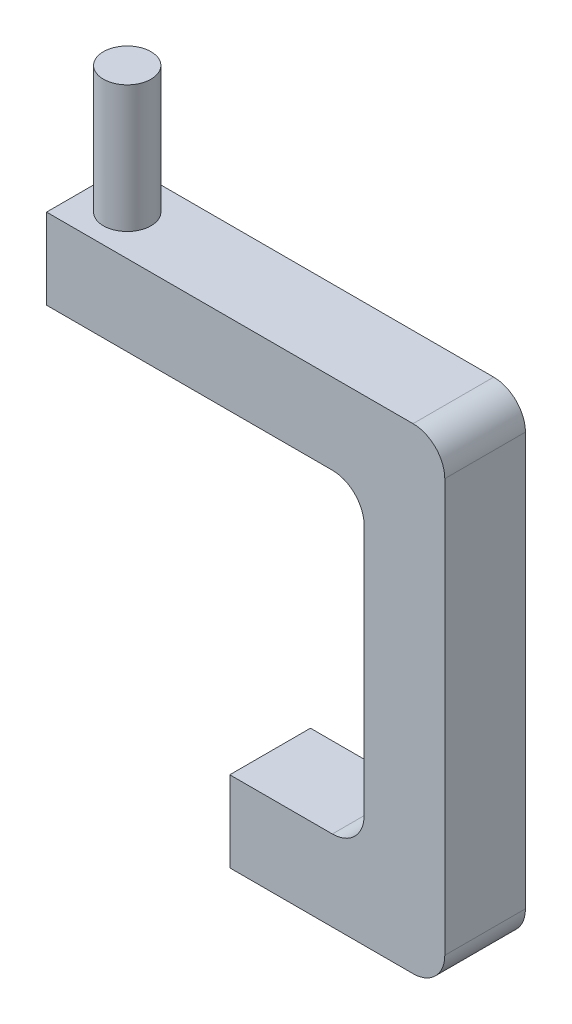
ISO-10303-21;
HEADER;
FILE_DESCRIPTION(('STEP AP214'),'2;1');
FILE_NAME('part.step','',(''),(''),'','','');
FILE_SCHEMA(('AUTOMOTIVE_DESIGN { 1 0 10303 214 1 1 1 1 }'));
ENDSEC;
DATA;
#1=APPLICATION_CONTEXT('core data for automotive mechanical design processes');
#2=APPLICATION_PROTOCOL_DEFINITION('international standard','automotive_design',2000,#1);
#3=PRODUCT_CONTEXT('',#1,'mechanical');
#4=PRODUCT('Part','Part','',(#3));
#5=PRODUCT_RELATED_PRODUCT_CATEGORY('part','',(#4));
#6=PRODUCT_DEFINITION_FORMATION('','',#4);
#7=PRODUCT_DEFINITION_CONTEXT('part definition',#1,'design');
#8=PRODUCT_DEFINITION('design','',#6,#7);
#9=PRODUCT_DEFINITION_SHAPE('','',#8);
#10=(LENGTH_UNIT() NAMED_UNIT(*) SI_UNIT(.MILLI.,.METRE.));
#11=(NAMED_UNIT(*) PLANE_ANGLE_UNIT() SI_UNIT($,.RADIAN.));
#12=(NAMED_UNIT(*) SI_UNIT($,.STERADIAN.) SOLID_ANGLE_UNIT());
#13=UNCERTAINTY_MEASURE_WITH_UNIT(LENGTH_MEASURE(1.E-05),#10,'distance_accuracy_value','');
#14=(GEOMETRIC_REPRESENTATION_CONTEXT(3) GLOBAL_UNCERTAINTY_ASSIGNED_CONTEXT((#13)) GLOBAL_UNIT_ASSIGNED_CONTEXT((#10,
#11,#12)) REPRESENTATION_CONTEXT('',''));
#15=CARTESIAN_POINT('',(0.,0.,0.));
#16=DIRECTION('',(0.,0.,1.));
#17=DIRECTION('',(1.,0.,0.));
#18=AXIS2_PLACEMENT_3D('',#15,#16,#17);
#19=CARTESIAN_POINT('',(0.,75.,25.4));
#20=DIRECTION('',(0.,-1.,0.));
#21=DIRECTION('',(1.,0.,0.));
#22=AXIS2_PLACEMENT_3D('',#19,#20,#21);
#23=PLANE('',#22);
#24=CARTESIAN_POINT('',(-100.,75.,12.7));
#25=DIRECTION('',(0.,-1.,0.));
#26=DIRECTION('',(1.,0.,0.));
#27=AXIS2_PLACEMENT_3D('',#24,#25,#26);
#28=CIRCLE('',#27,7.5);
#29=CARTESIAN_POINT('',(-92.5,75.,12.7));
#30=VERTEX_POINT('',#29);
#31=EDGE_CURVE('E161',#30,#30,#28,.F.);
#32=ORIENTED_EDGE('',*,*,#31,.F.);
#33=EDGE_LOOP('',(#32));
#34=FACE_BOUND('',#33,.T.);
#35=DIRECTION('',(-1.,0.,0.));
#36=VECTOR('',#35,1.);
#37=CARTESIAN_POINT('',(0.,75.,25.4));
#38=LINE('',#37,#36);
#39=CARTESIAN_POINT('',(2.69999999999998,75.,25.4));
#40=VERTEX_POINT('',#39);
#41=CARTESIAN_POINT('',(-112.7,75.,25.4));
#42=VERTEX_POINT('',#41);
#43=EDGE_CURVE('E131',#40,#42,#38,.T.);
#44=ORIENTED_EDGE('',*,*,#43,.F.);
#45=DIRECTION('',(0.,0.,-1.));
#46=VECTOR('',#45,1.);
#47=CARTESIAN_POINT('',(2.69999999999998,75.,0.));
#48=LINE('',#47,#46);
#49=CARTESIAN_POINT('',(2.69999999999998,75.,0.));
#50=VERTEX_POINT('',#49);
#51=EDGE_CURVE('E181',#40,#50,#48,.T.);
#52=ORIENTED_EDGE('',*,*,#51,.T.);
#53=DIRECTION('',(-1.,0.,0.));
#54=VECTOR('',#53,1.);
#55=CARTESIAN_POINT('',(0.,75.,0.));
#56=LINE('',#55,#54);
#57=CARTESIAN_POINT('',(-112.7,75.,0.));
#58=VERTEX_POINT('',#57);
#59=EDGE_CURVE('E158',#50,#58,#56,.T.);
#60=ORIENTED_EDGE('',*,*,#59,.T.);
#61=DIRECTION('',(0.,0.,-1.));
#62=VECTOR('',#61,1.);
#63=CARTESIAN_POINT('',(-112.7,75.,25.4));
#64=LINE('',#63,#62);
#65=EDGE_CURVE('E151',#42,#58,#64,.T.);
#66=ORIENTED_EDGE('',*,*,#65,.F.);
#67=EDGE_LOOP('',(#44,#52,#60,#66));
#68=FACE_BOUND('',#67,.T.);
#69=ADVANCED_FACE('F41',(#34,#68),#23,.F.);
#70=CARTESIAN_POINT('',(-112.7,0.,25.4));
#71=DIRECTION('',(1.,0.,0.));
#72=DIRECTION('',(0.,1.,0.));
#73=AXIS2_PLACEMENT_3D('',#70,#71,#72);
#74=PLANE('',#73);
#75=DIRECTION('',(0.,-1.,0.));
#76=VECTOR('',#75,1.);
#77=CARTESIAN_POINT('',(-112.7,0.,0.));
#78=LINE('',#77,#76);
#79=CARTESIAN_POINT('',(-112.7,49.6,0.));
#80=VERTEX_POINT('',#79);
#81=EDGE_CURVE('E259',#58,#80,#78,.T.);
#82=ORIENTED_EDGE('',*,*,#81,.T.);
#83=DIRECTION('',(0.,0.,-1.));
#84=VECTOR('',#83,1.);
#85=CARTESIAN_POINT('',(-112.7,49.6,25.4));
#86=LINE('',#85,#84);
#87=CARTESIAN_POINT('',(-112.7,49.6,25.4));
#88=VERTEX_POINT('',#87);
#89=EDGE_CURVE('E153',#88,#80,#86,.T.);
#90=ORIENTED_EDGE('',*,*,#89,.F.);
#91=DIRECTION('',(0.,-1.,0.));
#92=VECTOR('',#91,1.);
#93=CARTESIAN_POINT('',(-112.7,0.,25.4));
#94=LINE('',#93,#92);
#95=EDGE_CURVE('E136',#42,#88,#94,.T.);
#96=ORIENTED_EDGE('',*,*,#95,.F.);
#97=ORIENTED_EDGE('',*,*,#65,.T.);
#98=EDGE_LOOP('',(#82,#90,#96,#97));
#99=FACE_BOUND('',#98,.T.);
#100=ADVANCED_FACE('F150',(#99),#74,.F.);
#101=CARTESIAN_POINT('',(0.,49.6,25.4));
#102=DIRECTION('',(0.,-1.,0.));
#103=DIRECTION('',(1.,0.,0.));
#104=AXIS2_PLACEMENT_3D('',#101,#102,#103);
#105=PLANE('',#104);
#106=DIRECTION('',(-1.,0.,0.));
#107=VECTOR('',#106,1.);
#108=CARTESIAN_POINT('',(0.,49.6,0.));
#109=LINE('',#108,#107);
#110=CARTESIAN_POINT('',(-22.7,49.6,0.));
#111=VERTEX_POINT('',#110);
#112=EDGE_CURVE('E230',#111,#80,#109,.T.);
#113=ORIENTED_EDGE('',*,*,#112,.F.);
#114=DIRECTION('',(0.,0.,-1.));
#115=VECTOR('',#114,1.);
#116=CARTESIAN_POINT('',(-22.7,49.6,25.4));
#117=LINE('',#116,#115);
#118=CARTESIAN_POINT('',(-22.7,49.6,25.4));
#119=VERTEX_POINT('',#118);
#120=EDGE_CURVE('E178',#111,#119,#117,.F.);
#121=ORIENTED_EDGE('',*,*,#120,.T.);
#122=DIRECTION('',(-1.,0.,0.));
#123=VECTOR('',#122,1.);
#124=CARTESIAN_POINT('',(0.,49.6,25.4));
#125=LINE('',#124,#123);
#126=EDGE_CURVE('E155',#119,#88,#125,.T.);
#127=ORIENTED_EDGE('',*,*,#126,.T.);
#128=ORIENTED_EDGE('',*,*,#89,.T.);
#129=EDGE_LOOP('',(#113,#121,#127,#128));
#130=FACE_BOUND('',#129,.T.);
#131=ADVANCED_FACE('F296',(#130),#105,.T.);
#132=CARTESIAN_POINT('',(-12.7,0.,25.4));
#133=DIRECTION('',(1.,0.,0.));
#134=DIRECTION('',(0.,1.,0.));
#135=AXIS2_PLACEMENT_3D('',#132,#133,#134);
#136=PLANE('',#135);
#137=DIRECTION('',(0.,-1.,0.));
#138=VECTOR('',#137,1.);
#139=CARTESIAN_POINT('',(-12.7,0.,25.4));
#140=LINE('',#139,#138);
#141=CARTESIAN_POINT('',(-12.7,39.6,25.4));
#142=VERTEX_POINT('',#141);
#143=CARTESIAN_POINT('',(-12.7,-39.6,25.4));
#144=VERTEX_POINT('',#143);
#145=EDGE_CURVE('E241',#142,#144,#140,.T.);
#146=ORIENTED_EDGE('',*,*,#145,.F.);
#147=DIRECTION('',(0.,0.,-1.));
#148=VECTOR('',#147,1.);
#149=CARTESIAN_POINT('',(-12.7,39.6,25.4));
#150=LINE('',#149,#148);
#151=CARTESIAN_POINT('',(-12.7,39.6,0.));
#152=VERTEX_POINT('',#151);
#153=EDGE_CURVE('E174',#142,#152,#150,.T.);
#154=ORIENTED_EDGE('',*,*,#153,.T.);
#155=DIRECTION('',(0.,-1.,0.));
#156=VECTOR('',#155,1.);
#157=CARTESIAN_POINT('',(-12.7,0.,0.));
#158=LINE('',#157,#156);
#159=CARTESIAN_POINT('',(-12.7,-39.6,0.));
#160=VERTEX_POINT('',#159);
#161=EDGE_CURVE('E219',#152,#160,#158,.T.);
#162=ORIENTED_EDGE('',*,*,#161,.T.);
#163=DIRECTION('',(0.,0.,-1.));
#164=VECTOR('',#163,1.);
#165=CARTESIAN_POINT('',(-12.7,-39.6,25.4));
#166=LINE('',#165,#164);
#167=EDGE_CURVE('E166',#160,#144,#166,.F.);
#168=ORIENTED_EDGE('',*,*,#167,.T.);
#169=EDGE_LOOP('',(#146,#154,#162,#168));
#170=FACE_BOUND('',#169,.T.);
#171=ADVANCED_FACE('F227',(#170),#136,.F.);
#172=CARTESIAN_POINT('',(0.,-49.6,25.4));
#173=DIRECTION('',(0.,-1.,0.));
#174=DIRECTION('',(1.,0.,0.));
#175=AXIS2_PLACEMENT_3D('',#172,#173,#174);
#176=PLANE('',#175);
#177=DIRECTION('',(-1.,0.,0.));
#178=VECTOR('',#177,1.);
#179=CARTESIAN_POINT('',(0.,-49.6,25.4));
#180=LINE('',#179,#178);
#181=CARTESIAN_POINT('',(-22.7,-49.6,25.4));
#182=VERTEX_POINT('',#181);
#183=CARTESIAN_POINT('',(-55.,-49.6,25.4));
#184=VERTEX_POINT('',#183);
#185=EDGE_CURVE('E236',#182,#184,#180,.T.);
#186=ORIENTED_EDGE('',*,*,#185,.F.);
#187=DIRECTION('',(0.,0.,-1.));
#188=VECTOR('',#187,1.);
#189=CARTESIAN_POINT('',(-22.7,-49.6,0.));
#190=LINE('',#189,#188);
#191=CARTESIAN_POINT('',(-22.7,-49.6,0.));
#192=VERTEX_POINT('',#191);
#193=EDGE_CURVE('E204',#182,#192,#190,.T.);
#194=ORIENTED_EDGE('',*,*,#193,.T.);
#195=DIRECTION('',(-1.,0.,0.));
#196=VECTOR('',#195,1.);
#197=CARTESIAN_POINT('',(0.,-49.6,0.));
#198=LINE('',#197,#196);
#199=CARTESIAN_POINT('',(-55.,-49.6,0.));
#200=VERTEX_POINT('',#199);
#201=EDGE_CURVE('E221',#192,#200,#198,.T.);
#202=ORIENTED_EDGE('',*,*,#201,.T.);
#203=DIRECTION('',(0.,0.,-1.));
#204=VECTOR('',#203,1.);
#205=CARTESIAN_POINT('',(-55.,-49.6,25.4));
#206=LINE('',#205,#204);
#207=EDGE_CURVE('E168',#184,#200,#206,.T.);
#208=ORIENTED_EDGE('',*,*,#207,.F.);
#209=EDGE_LOOP('',(#186,#194,#202,#208));
#210=FACE_BOUND('',#209,.T.);
#211=ADVANCED_FACE('F233',(#210),#176,.F.);
#212=CARTESIAN_POINT('',(-55.,0.,25.4));
#213=DIRECTION('',(-1.,0.,0.));
#214=DIRECTION('',(0.,0.,1.));
#215=AXIS2_PLACEMENT_3D('',#212,#213,#214);
#216=PLANE('',#215);
#217=CARTESIAN_POINT('',(-55.,-62.3,12.7));
#218=DIRECTION('',(-1.,0.,0.));
#219=DIRECTION('',(0.,0.,1.));
#220=AXIS2_PLACEMENT_3D('',#217,#218,#219);
#221=CIRCLE('',#220,7.5);
#222=CARTESIAN_POINT('',(-55.,-62.3,20.2));
#223=VERTEX_POINT('',#222);
#224=EDGE_CURVE('E304',#223,#223,#221,.T.);
#225=ORIENTED_EDGE('',*,*,#224,.F.);
#226=EDGE_LOOP('',(#225));
#227=FACE_BOUND('',#226,.T.);
#228=DIRECTION('',(0.,1.,0.));
#229=VECTOR('',#228,1.);
#230=CARTESIAN_POINT('',(-55.,0.,0.));
#231=LINE('',#230,#229);
#232=CARTESIAN_POINT('',(-55.,-75.,0.));
#233=VERTEX_POINT('',#232);
#234=EDGE_CURVE('E267',#233,#200,#231,.T.);
#235=ORIENTED_EDGE('',*,*,#234,.F.);
#236=DIRECTION('',(0.,0.,-1.));
#237=VECTOR('',#236,1.);
#238=CARTESIAN_POINT('',(-55.,-75.,25.4));
#239=LINE('',#238,#237);
#240=CARTESIAN_POINT('',(-55.,-75.,25.4));
#241=VERTEX_POINT('',#240);
#242=EDGE_CURVE('E256',#241,#233,#239,.T.);
#243=ORIENTED_EDGE('',*,*,#242,.F.);
#244=DIRECTION('',(0.,1.,0.));
#245=VECTOR('',#244,1.);
#246=CARTESIAN_POINT('',(-55.,0.,25.4));
#247=LINE('',#246,#245);
#248=EDGE_CURVE('E240',#241,#184,#247,.T.);
#249=ORIENTED_EDGE('',*,*,#248,.T.);
#250=ORIENTED_EDGE('',*,*,#207,.T.);
#251=EDGE_LOOP('',(#235,#243,#249,#250));
#252=FACE_BOUND('',#251,.T.);
#253=ADVANCED_FACE('F280',(#227,#252),#216,.T.);
#254=CARTESIAN_POINT('',(0.,-75.,25.4));
#255=DIRECTION('',(0.,1.,0.));
#256=DIRECTION('',(0.,0.,1.));
#257=AXIS2_PLACEMENT_3D('',#254,#255,#256);
#258=PLANE('',#257);
#259=DIRECTION('',(1.,0.,0.));
#260=VECTOR('',#259,1.);
#261=CARTESIAN_POINT('',(0.,-75.,0.));
#262=LINE('',#261,#260);
#263=CARTESIAN_POINT('',(2.7,-75.,0.));
#264=VERTEX_POINT('',#263);
#265=EDGE_CURVE('E270',#233,#264,#262,.T.);
#266=ORIENTED_EDGE('',*,*,#265,.T.);
#267=DIRECTION('',(0.,0.,-1.));
#268=VECTOR('',#267,1.);
#269=CARTESIAN_POINT('',(2.7,-75.,25.4));
#270=LINE('',#269,#268);
#271=CARTESIAN_POINT('',(2.7,-75.,25.4));
#272=VERTEX_POINT('',#271);
#273=EDGE_CURVE('E57',#264,#272,#270,.F.);
#274=ORIENTED_EDGE('',*,*,#273,.T.);
#275=DIRECTION('',(1.,0.,0.));
#276=VECTOR('',#275,1.);
#277=CARTESIAN_POINT('',(0.,-75.,25.4));
#278=LINE('',#277,#276);
#279=EDGE_CURVE('E245',#241,#272,#278,.T.);
#280=ORIENTED_EDGE('',*,*,#279,.F.);
#281=ORIENTED_EDGE('',*,*,#242,.T.);
#282=EDGE_LOOP('',(#266,#274,#280,#281));
#283=FACE_BOUND('',#282,.T.);
#284=ADVANCED_FACE('F282',(#283),#258,.F.);
#285=CARTESIAN_POINT('',(12.7,0.,25.4));
#286=DIRECTION('',(1.,0.,0.));
#287=DIRECTION('',(0.,1.,0.));
#288=AXIS2_PLACEMENT_3D('',#285,#286,#287);
#289=PLANE('',#288);
#290=DIRECTION('',(0.,-1.,0.));
#291=VECTOR('',#290,1.);
#292=CARTESIAN_POINT('',(12.7,0.,0.));
#293=LINE('',#292,#291);
#294=CARTESIAN_POINT('',(12.7,65.,0.));
#295=VERTEX_POINT('',#294);
#296=CARTESIAN_POINT('',(12.7,-65.,0.));
#297=VERTEX_POINT('',#296);
#298=EDGE_CURVE('E145',#295,#297,#293,.T.);
#299=ORIENTED_EDGE('',*,*,#298,.F.);
#300=DIRECTION('',(0.,0.,-1.));
#301=VECTOR('',#300,1.);
#302=CARTESIAN_POINT('',(12.7,65.,25.4));
#303=LINE('',#302,#301);
#304=CARTESIAN_POINT('',(12.7,65.,25.4));
#305=VERTEX_POINT('',#304);
#306=EDGE_CURVE('E194',#295,#305,#303,.F.);
#307=ORIENTED_EDGE('',*,*,#306,.T.);
#308=DIRECTION('',(0.,-1.,0.));
#309=VECTOR('',#308,1.);
#310=CARTESIAN_POINT('',(12.7,0.,25.4));
#311=LINE('',#310,#309);
#312=CARTESIAN_POINT('',(12.7,-65.,25.4));
#313=VERTEX_POINT('',#312);
#314=EDGE_CURVE('E252',#305,#313,#311,.T.);
#315=ORIENTED_EDGE('',*,*,#314,.T.);
#316=DIRECTION('',(0.,0.,-1.));
#317=VECTOR('',#316,1.);
#318=CARTESIAN_POINT('',(12.7,-65.,0.));
#319=LINE('',#318,#317);
#320=EDGE_CURVE('E190',#313,#297,#319,.T.);
#321=ORIENTED_EDGE('',*,*,#320,.T.);
#322=EDGE_LOOP('',(#299,#307,#315,#321));
#323=FACE_BOUND('',#322,.T.);
#324=ADVANCED_FACE('F289',(#323),#289,.T.);
#325=CARTESIAN_POINT('',(0.,0.,25.4));
#326=DIRECTION('',(0.,0.,1.));
#327=DIRECTION('',(1.,0.,0.));
#328=AXIS2_PLACEMENT_3D('',#325,#326,#327);
#329=PLANE('',#328);
#330=ORIENTED_EDGE('',*,*,#314,.F.);
#331=CARTESIAN_POINT('',(2.69999999999999,65.,25.4));
#332=DIRECTION('',(0.,0.,1.));
#333=DIRECTION('',(1.,0.,0.));
#334=AXIS2_PLACEMENT_3D('',#331,#332,#333);
#335=CIRCLE('',#334,10.);
#336=EDGE_CURVE('E139',#305,#40,#335,.T.);
#337=ORIENTED_EDGE('',*,*,#336,.T.);
#338=ORIENTED_EDGE('',*,*,#43,.T.);
#339=ORIENTED_EDGE('',*,*,#95,.T.);
#340=ORIENTED_EDGE('',*,*,#126,.F.);
#341=CARTESIAN_POINT('',(-22.7,39.6,25.4));
#342=DIRECTION('',(0.,0.,1.));
#343=DIRECTION('',(1.,0.,0.));
#344=AXIS2_PLACEMENT_3D('',#341,#342,#343);
#345=CIRCLE('',#344,10.);
#346=EDGE_CURVE('E211',#119,#142,#345,.F.);
#347=ORIENTED_EDGE('',*,*,#346,.T.);
#348=ORIENTED_EDGE('',*,*,#145,.T.);
#349=CARTESIAN_POINT('',(-22.7,-39.6,25.4));
#350=DIRECTION('',(0.,0.,1.));
#351=DIRECTION('',(1.,0.,0.));
#352=AXIS2_PLACEMENT_3D('',#349,#350,#351);
#353=CIRCLE('',#352,10.);
#354=EDGE_CURVE('E11',#144,#182,#353,.F.);
#355=ORIENTED_EDGE('',*,*,#354,.T.);
#356=ORIENTED_EDGE('',*,*,#185,.T.);
#357=ORIENTED_EDGE('',*,*,#248,.F.);
#358=ORIENTED_EDGE('',*,*,#279,.T.);
#359=CARTESIAN_POINT('',(2.7,-65.,25.4));
#360=DIRECTION('',(0.,0.,1.));
#361=DIRECTION('',(1.,0.,0.));
#362=AXIS2_PLACEMENT_3D('',#359,#360,#361);
#363=CIRCLE('',#362,10.);
#364=EDGE_CURVE('E197',#272,#313,#363,.T.);
#365=ORIENTED_EDGE('',*,*,#364,.T.);
#366=EDGE_LOOP('',(#330,#337,#338,#339,#340,#347,#348,#355,#356,#357,#358,#365));
#367=FACE_BOUND('',#366,.T.);
#368=ADVANCED_FACE('F134',(#367),#329,.T.);
#369=CARTESIAN_POINT('',(0.,0.,0.));
#370=DIRECTION('',(0.,0.,1.));
#371=DIRECTION('',(1.,0.,0.));
#372=AXIS2_PLACEMENT_3D('',#369,#370,#371);
#373=PLANE('',#372);
#374=ORIENTED_EDGE('',*,*,#59,.F.);
#375=CARTESIAN_POINT('',(2.69999999999999,65.,0.));
#376=DIRECTION('',(0.,0.,1.));
#377=DIRECTION('',(1.,0.,0.));
#378=AXIS2_PLACEMENT_3D('',#375,#376,#377);
#379=CIRCLE('',#378,10.);
#380=EDGE_CURVE('E187',#50,#295,#379,.F.);
#381=ORIENTED_EDGE('',*,*,#380,.T.);
#382=ORIENTED_EDGE('',*,*,#298,.T.);
#383=CARTESIAN_POINT('',(2.7,-65.,0.));
#384=DIRECTION('',(0.,0.,1.));
#385=DIRECTION('',(1.,0.,0.));
#386=AXIS2_PLACEMENT_3D('',#383,#384,#385);
#387=CIRCLE('',#386,10.);
#388=EDGE_CURVE('E184',#297,#264,#387,.F.);
#389=ORIENTED_EDGE('',*,*,#388,.T.);
#390=ORIENTED_EDGE('',*,*,#265,.F.);
#391=ORIENTED_EDGE('',*,*,#234,.T.);
#392=ORIENTED_EDGE('',*,*,#201,.F.);
#393=CARTESIAN_POINT('',(-22.7,-39.6,0.));
#394=DIRECTION('',(0.,0.,1.));
#395=DIRECTION('',(1.,0.,0.));
#396=AXIS2_PLACEMENT_3D('',#393,#394,#395);
#397=CIRCLE('',#396,10.);
#398=EDGE_CURVE('E50',#192,#160,#397,.T.);
#399=ORIENTED_EDGE('',*,*,#398,.T.);
#400=ORIENTED_EDGE('',*,*,#161,.F.);
#401=CARTESIAN_POINT('',(-22.7,39.6,0.));
#402=DIRECTION('',(0.,0.,1.));
#403=DIRECTION('',(1.,0.,0.));
#404=AXIS2_PLACEMENT_3D('',#401,#402,#403);
#405=CIRCLE('',#404,10.);
#406=EDGE_CURVE('E208',#152,#111,#405,.T.);
#407=ORIENTED_EDGE('',*,*,#406,.T.);
#408=ORIENTED_EDGE('',*,*,#112,.T.);
#409=ORIENTED_EDGE('',*,*,#81,.F.);
#410=EDGE_LOOP('',(#374,#381,#382,#389,#390,#391,#392,#399,#400,#407,#408,#409));
#411=FACE_BOUND('',#410,.T.);
#412=ADVANCED_FACE('F218',(#411),#373,.F.);
#413=CARTESIAN_POINT('',(-100.,115.,12.7));
#414=DIRECTION('',(0.,-1.,0.));
#415=DIRECTION('',(1.,0.,0.));
#416=AXIS2_PLACEMENT_3D('',#413,#414,#415);
#417=CYLINDRICAL_SURFACE('',#416,7.5);
#418=CARTESIAN_POINT('',(-100.,115.,12.7));
#419=DIRECTION('',(0.,1.,0.));
#420=DIRECTION('',(-1.,0.,0.));
#421=AXIS2_PLACEMENT_3D('',#418,#419,#420);
#422=CIRCLE('',#421,7.5);
#423=CARTESIAN_POINT('',(-107.5,115.,12.7));
#424=VERTEX_POINT('',#423);
#425=EDGE_CURVE('E260',#424,#424,#422,.T.);
#426=ORIENTED_EDGE('',*,*,#425,.F.);
#427=EDGE_LOOP('',(#426));
#428=FACE_BOUND('',#427,.T.);
#429=ORIENTED_EDGE('',*,*,#31,.T.);
#430=EDGE_LOOP('',(#429));
#431=FACE_BOUND('',#430,.T.);
#432=ADVANCED_FACE('F377',(#428,#431),#417,.T.);
#433=CARTESIAN_POINT('',(0.,115.,0.));
#434=DIRECTION('',(0.,1.,0.));
#435=DIRECTION('',(-1.,0.,0.));
#436=AXIS2_PLACEMENT_3D('',#433,#434,#435);
#437=PLANE('',#436);
#438=ORIENTED_EDGE('',*,*,#425,.T.);
#439=EDGE_LOOP('',(#438));
#440=FACE_BOUND('',#439,.T.);
#441=ADVANCED_FACE('F317',(#440),#437,.T.);
#442=CARTESIAN_POINT('',(-25.,-62.3,12.7));
#443=DIRECTION('',(-1.,0.,0.));
#444=DIRECTION('',(0.,0.,1.));
#445=AXIS2_PLACEMENT_3D('',#442,#443,#444);
#446=CYLINDRICAL_SURFACE('',#445,7.5);
#447=CARTESIAN_POINT('',(-25.,-62.3,12.7));
#448=DIRECTION('',(-1.,0.,0.));
#449=DIRECTION('',(0.,0.,1.));
#450=AXIS2_PLACEMENT_3D('',#447,#448,#449);
#451=CIRCLE('',#450,7.5);
#452=CARTESIAN_POINT('',(-25.,-62.3,20.2));
#453=VERTEX_POINT('',#452);
#454=EDGE_CURVE('E303',#453,#453,#451,.T.);
#455=ORIENTED_EDGE('',*,*,#454,.F.);
#456=EDGE_LOOP('',(#455));
#457=FACE_BOUND('',#456,.T.);
#458=ORIENTED_EDGE('',*,*,#224,.T.);
#459=EDGE_LOOP('',(#458));
#460=FACE_BOUND('',#459,.T.);
#461=ADVANCED_FACE('F314',(#457,#460),#446,.F.);
#462=CARTESIAN_POINT('',(-25.,0.,0.));
#463=DIRECTION('',(-1.,0.,0.));
#464=DIRECTION('',(0.,0.,1.));
#465=AXIS2_PLACEMENT_3D('',#462,#463,#464);
#466=PLANE('',#465);
#467=ORIENTED_EDGE('',*,*,#454,.T.);
#468=EDGE_LOOP('',(#467));
#469=FACE_BOUND('',#468,.T.);
#470=ADVANCED_FACE('F312',(#469),#466,.T.);
#471=CARTESIAN_POINT('',(-22.7,39.6,25.4));
#472=DIRECTION('',(0.,0.,-1.));
#473=DIRECTION('',(-1.,0.,0.));
#474=AXIS2_PLACEMENT_3D('',#471,#472,#473);
#475=CYLINDRICAL_SURFACE('',#474,10.);
#476=ORIENTED_EDGE('',*,*,#346,.F.);
#477=ORIENTED_EDGE('',*,*,#120,.F.);
#478=ORIENTED_EDGE('',*,*,#406,.F.);
#479=ORIENTED_EDGE('',*,*,#153,.F.);
#480=EDGE_LOOP('',(#476,#477,#478,#479));
#481=FACE_BOUND('',#480,.T.);
#482=ADVANCED_FACE('F339',(#481),#475,.F.);
#483=CARTESIAN_POINT('',(2.69999999999999,65.,25.4));
#484=DIRECTION('',(0.,0.,1.));
#485=DIRECTION('',(1.,0.,0.));
#486=AXIS2_PLACEMENT_3D('',#483,#484,#485);
#487=CYLINDRICAL_SURFACE('',#486,10.);
#488=ORIENTED_EDGE('',*,*,#336,.F.);
#489=ORIENTED_EDGE('',*,*,#306,.F.);
#490=ORIENTED_EDGE('',*,*,#380,.F.);
#491=ORIENTED_EDGE('',*,*,#51,.F.);
#492=EDGE_LOOP('',(#488,#489,#490,#491));
#493=FACE_BOUND('',#492,.T.);
#494=ADVANCED_FACE('F292',(#493),#487,.T.);
#495=CARTESIAN_POINT('',(2.7,-65.,25.4));
#496=DIRECTION('',(0.,0.,1.));
#497=DIRECTION('',(1.,0.,0.));
#498=AXIS2_PLACEMENT_3D('',#495,#496,#497);
#499=CYLINDRICAL_SURFACE('',#498,10.);
#500=ORIENTED_EDGE('',*,*,#364,.F.);
#501=ORIENTED_EDGE('',*,*,#273,.F.);
#502=ORIENTED_EDGE('',*,*,#388,.F.);
#503=ORIENTED_EDGE('',*,*,#320,.F.);
#504=EDGE_LOOP('',(#500,#501,#502,#503));
#505=FACE_BOUND('',#504,.T.);
#506=ADVANCED_FACE('F285',(#505),#499,.T.);
#507=CARTESIAN_POINT('',(-22.7,-39.6,25.4));
#508=DIRECTION('',(0.,0.,1.));
#509=DIRECTION('',(1.,0.,0.));
#510=AXIS2_PLACEMENT_3D('',#507,#508,#509);
#511=CYLINDRICAL_SURFACE('',#510,10.);
#512=ORIENTED_EDGE('',*,*,#354,.F.);
#513=ORIENTED_EDGE('',*,*,#167,.F.);
#514=ORIENTED_EDGE('',*,*,#398,.F.);
#515=ORIENTED_EDGE('',*,*,#193,.F.);
#516=EDGE_LOOP('',(#512,#513,#514,#515));
#517=FACE_BOUND('',#516,.T.);
#518=ADVANCED_FACE('F43',(#517),#511,.F.);
#519=CLOSED_SHELL('',(#69,#100,#131,#171,#211,#253,#284,#324,#368,#412,#432,#441,#461,#470,#482,
#494,#506,#518));
#520=MANIFOLD_SOLID_BREP('B2',#519);
#521=ADVANCED_BREP_SHAPE_REPRESENTATION('',(#18,#520),#14);
#522=SHAPE_DEFINITION_REPRESENTATION(#9,#521);
ENDSEC;
END-ISO-10303-21;
